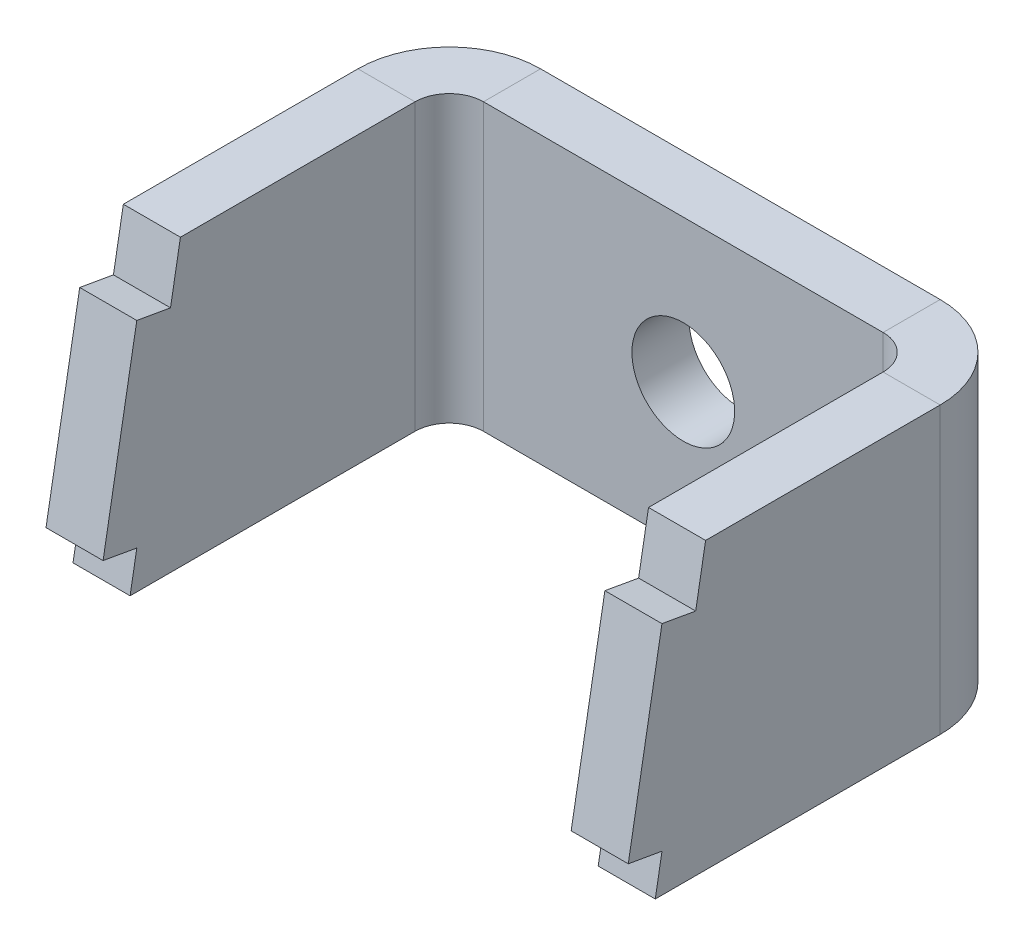
ISO-10303-21;
HEADER;
FILE_DESCRIPTION(('STEP AP214'),'2;1');
FILE_NAME('part.step','',(''),(''),'','','');
FILE_SCHEMA(('AUTOMOTIVE_DESIGN { 1 0 10303 214 1 1 1 1 }'));
ENDSEC;
DATA;
#1=APPLICATION_CONTEXT('core data for automotive mechanical design processes');
#2=APPLICATION_PROTOCOL_DEFINITION('international standard','automotive_design',2000,#1);
#3=PRODUCT_CONTEXT('',#1,'mechanical');
#4=PRODUCT('Part','Part','',(#3));
#5=PRODUCT_RELATED_PRODUCT_CATEGORY('part','',(#4));
#6=PRODUCT_DEFINITION_FORMATION('','',#4);
#7=PRODUCT_DEFINITION_CONTEXT('part definition',#1,'design');
#8=PRODUCT_DEFINITION('design','',#6,#7);
#9=PRODUCT_DEFINITION_SHAPE('','',#8);
#10=(LENGTH_UNIT() NAMED_UNIT(*) SI_UNIT(.MILLI.,.METRE.));
#11=(NAMED_UNIT(*) PLANE_ANGLE_UNIT() SI_UNIT($,.RADIAN.));
#12=(NAMED_UNIT(*) SI_UNIT($,.STERADIAN.) SOLID_ANGLE_UNIT());
#13=UNCERTAINTY_MEASURE_WITH_UNIT(LENGTH_MEASURE(1.E-05),#10,'distance_accuracy_value','');
#14=(GEOMETRIC_REPRESENTATION_CONTEXT(3) GLOBAL_UNCERTAINTY_ASSIGNED_CONTEXT((#13)) GLOBAL_UNIT_ASSIGNED_CONTEXT((#10,
#11,#12)) REPRESENTATION_CONTEXT('',''));
#15=CARTESIAN_POINT('',(0.,0.,0.));
#16=DIRECTION('',(0.,0.,1.));
#17=DIRECTION('',(1.,0.,0.));
#18=AXIS2_PLACEMENT_3D('',#15,#16,#17);
#19=CARTESIAN_POINT('',(17.5,25.,-5.));
#20=DIRECTION('',(0.,1.,0.));
#21=DIRECTION('',(-1.,0.,0.));
#22=AXIS2_PLACEMENT_3D('',#19,#20,#21);
#23=PLANE('',#22);
#24=DIRECTION('',(-1.,0.,0.));
#25=VECTOR('',#24,1.);
#26=CARTESIAN_POINT('',(17.5,25.,0.));
#27=LINE('',#26,#25);
#28=CARTESIAN_POINT('',(17.5,25.,0.));
#29=VERTEX_POINT('',#28);
#30=CARTESIAN_POINT('',(-17.5,25.,0.));
#31=VERTEX_POINT('',#30);
#32=EDGE_CURVE('E362',#29,#31,#27,.T.);
#33=ORIENTED_EDGE('',*,*,#32,.F.);
#34=DIRECTION('',(0.,0.,1.));
#35=VECTOR('',#34,1.);
#36=CARTESIAN_POINT('',(17.5,25.,-5.));
#37=LINE('',#36,#35);
#38=CARTESIAN_POINT('',(17.5,25.,-5.));
#39=VERTEX_POINT('',#38);
#40=EDGE_CURVE('E394',#39,#29,#37,.T.);
#41=ORIENTED_EDGE('',*,*,#40,.F.);
#42=DIRECTION('',(-1.,0.,0.));
#43=VECTOR('',#42,1.);
#44=CARTESIAN_POINT('',(17.5,25.,-5.));
#45=LINE('',#44,#43);
#46=CARTESIAN_POINT('',(-17.5,25.,-5.));
#47=VERTEX_POINT('',#46);
#48=EDGE_CURVE('E371',#39,#47,#45,.T.);
#49=ORIENTED_EDGE('',*,*,#48,.T.);
#50=DIRECTION('',(0.,0.,1.));
#51=VECTOR('',#50,1.);
#52=CARTESIAN_POINT('',(-17.5,25.,-5.));
#53=LINE('',#52,#51);
#54=EDGE_CURVE('E383',#47,#31,#53,.T.);
#55=ORIENTED_EDGE('',*,*,#54,.T.);
#56=EDGE_LOOP('',(#33,#41,#49,#55));
#57=FACE_BOUND('',#56,.T.);
#58=ADVANCED_FACE('F83',(#57),#23,.T.);
#59=CARTESIAN_POINT('',(-17.5,0.,-5.));
#60=DIRECTION('',(0.,-1.,0.));
#61=DIRECTION('',(1.,0.,0.));
#62=AXIS2_PLACEMENT_3D('',#59,#60,#61);
#63=PLANE('',#62);
#64=DIRECTION('',(1.,0.,0.));
#65=VECTOR('',#64,1.);
#66=CARTESIAN_POINT('',(-17.5,0.,0.));
#67=LINE('',#66,#65);
#68=CARTESIAN_POINT('',(-17.5,0.,0.));
#69=VERTEX_POINT('',#68);
#70=CARTESIAN_POINT('',(17.5,0.,0.));
#71=VERTEX_POINT('',#70);
#72=EDGE_CURVE('E389',#69,#71,#67,.T.);
#73=ORIENTED_EDGE('',*,*,#72,.F.);
#74=DIRECTION('',(0.,0.,1.));
#75=VECTOR('',#74,1.);
#76=CARTESIAN_POINT('',(-17.5,0.,-5.));
#77=LINE('',#76,#75);
#78=CARTESIAN_POINT('',(-17.5,0.,-5.));
#79=VERTEX_POINT('',#78);
#80=EDGE_CURVE('E399',#79,#69,#77,.T.);
#81=ORIENTED_EDGE('',*,*,#80,.F.);
#82=DIRECTION('',(1.,0.,0.));
#83=VECTOR('',#82,1.);
#84=CARTESIAN_POINT('',(-17.5,0.,-5.));
#85=LINE('',#84,#83);
#86=CARTESIAN_POINT('',(17.5,0.,-5.));
#87=VERTEX_POINT('',#86);
#88=EDGE_CURVE('E378',#79,#87,#85,.T.);
#89=ORIENTED_EDGE('',*,*,#88,.T.);
#90=DIRECTION('',(0.,0.,1.));
#91=VECTOR('',#90,1.);
#92=CARTESIAN_POINT('',(17.5,0.,-5.));
#93=LINE('',#92,#91);
#94=EDGE_CURVE('E397',#87,#71,#93,.T.);
#95=ORIENTED_EDGE('',*,*,#94,.T.);
#96=EDGE_LOOP('',(#73,#81,#89,#95));
#97=FACE_BOUND('',#96,.T.);
#98=ADVANCED_FACE('F438',(#97),#63,.T.);
#99=CARTESIAN_POINT('',(0.,0.,-5.));
#100=DIRECTION('',(0.,0.,-1.));
#101=DIRECTION('',(-1.,0.,0.));
#102=AXIS2_PLACEMENT_3D('',#99,#100,#101);
#103=PLANE('',#102);
#104=CARTESIAN_POINT('',(0.,12.5,-5.));
#105=DIRECTION('',(0.,0.,-1.));
#106=DIRECTION('',(-1.,0.,0.));
#107=AXIS2_PLACEMENT_3D('',#104,#105,#106);
#108=CIRCLE('',#107,4.5);
#109=CARTESIAN_POINT('',(-4.5,12.5,-5.));
#110=VERTEX_POINT('',#109);
#111=EDGE_CURVE('E253',#110,#110,#108,.T.);
#112=ORIENTED_EDGE('',*,*,#111,.F.);
#113=EDGE_LOOP('',(#112));
#114=FACE_BOUND('',#113,.T.);
#115=ORIENTED_EDGE('',*,*,#48,.F.);
#116=DIRECTION('',(0.,1.,0.));
#117=VECTOR('',#116,1.);
#118=CARTESIAN_POINT('',(17.5,0.,-5.));
#119=LINE('',#118,#117);
#120=EDGE_CURVE('E380',#87,#39,#119,.T.);
#121=ORIENTED_EDGE('',*,*,#120,.F.);
#122=ORIENTED_EDGE('',*,*,#88,.F.);
#123=DIRECTION('',(0.,-1.,0.));
#124=VECTOR('',#123,1.);
#125=CARTESIAN_POINT('',(-17.5,0.,-5.));
#126=LINE('',#125,#124);
#127=EDGE_CURVE('E374',#47,#79,#126,.T.);
#128=ORIENTED_EDGE('',*,*,#127,.F.);
#129=EDGE_LOOP('',(#115,#121,#122,#128));
#130=FACE_BOUND('',#129,.T.);
#131=ADVANCED_FACE('F434',(#114,#130),#103,.T.);
#132=CARTESIAN_POINT('',(0.,0.,0.));
#133=DIRECTION('',(0.,0.,-1.));
#134=DIRECTION('',(-1.,0.,0.));
#135=AXIS2_PLACEMENT_3D('',#132,#133,#134);
#136=PLANE('',#135);
#137=CARTESIAN_POINT('',(0.,12.5,0.));
#138=DIRECTION('',(0.,0.,-1.));
#139=DIRECTION('',(-1.,0.,0.));
#140=AXIS2_PLACEMENT_3D('',#137,#138,#139);
#141=CIRCLE('',#140,4.5);
#142=CARTESIAN_POINT('',(-4.5,12.5,0.));
#143=VERTEX_POINT('',#142);
#144=EDGE_CURVE('E86',#143,#143,#141,.T.);
#145=ORIENTED_EDGE('',*,*,#144,.T.);
#146=EDGE_LOOP('',(#145));
#147=FACE_BOUND('',#146,.T.);
#148=ORIENTED_EDGE('',*,*,#32,.T.);
#149=DIRECTION('',(0.,-1.,0.));
#150=VECTOR('',#149,1.);
#151=CARTESIAN_POINT('',(-17.5,0.,0.));
#152=LINE('',#151,#150);
#153=EDGE_CURVE('E386',#31,#69,#152,.T.);
#154=ORIENTED_EDGE('',*,*,#153,.T.);
#155=ORIENTED_EDGE('',*,*,#72,.T.);
#156=DIRECTION('',(0.,1.,0.));
#157=VECTOR('',#156,1.);
#158=CARTESIAN_POINT('',(17.5,0.,0.));
#159=LINE('',#158,#157);
#160=EDGE_CURVE('E375',#71,#29,#159,.T.);
#161=ORIENTED_EDGE('',*,*,#160,.T.);
#162=EDGE_LOOP('',(#148,#154,#155,#161));
#163=FACE_BOUND('',#162,.T.);
#164=ADVANCED_FACE('F437',(#147,#163),#136,.F.);
#165=CARTESIAN_POINT('',(-17.5,25.,3.));
#166=DIRECTION('',(0.,1.,0.));
#167=DIRECTION('',(0.,0.,1.));
#168=AXIS2_PLACEMENT_3D('',#165,#166,#167);
#169=PLANE('',#168);
#170=DIRECTION('',(-1.,0.,0.));
#171=VECTOR('',#170,1.);
#172=CARTESIAN_POINT('',(-25.5,25.,2.99999999999997));
#173=LINE('',#172,#171);
#174=CARTESIAN_POINT('',(-20.5,25.,2.99999999999999));
#175=VERTEX_POINT('',#174);
#176=CARTESIAN_POINT('',(-25.5,25.,2.99999999999997));
#177=VERTEX_POINT('',#176);
#178=EDGE_CURVE('E329',#175,#177,#173,.T.);
#179=ORIENTED_EDGE('',*,*,#178,.F.);
#180=CARTESIAN_POINT('',(-17.5,25.,3.));
#181=DIRECTION('',(0.,-1.,0.));
#182=DIRECTION('',(0.,0.,-1.));
#183=AXIS2_PLACEMENT_3D('',#180,#181,#182);
#184=CIRCLE('',#183,3.);
#185=EDGE_CURVE('E366',#31,#175,#184,.F.);
#186=ORIENTED_EDGE('',*,*,#185,.F.);
#187=ORIENTED_EDGE('',*,*,#54,.F.);
#188=CARTESIAN_POINT('',(-17.5,25.,3.));
#189=DIRECTION('',(0.,-1.,0.));
#190=DIRECTION('',(0.,0.,-1.));
#191=AXIS2_PLACEMENT_3D('',#188,#189,#190);
#192=CIRCLE('',#191,8.);
#193=EDGE_CURVE('E359',#47,#177,#192,.F.);
#194=ORIENTED_EDGE('',*,*,#193,.T.);
#195=EDGE_LOOP('',(#179,#186,#187,#194));
#196=FACE_BOUND('',#195,.T.);
#197=ADVANCED_FACE('F483',(#196),#169,.T.);
#198=CARTESIAN_POINT('',(-17.5,0.,3.));
#199=DIRECTION('',(0.,1.,0.));
#200=DIRECTION('',(0.,0.,1.));
#201=AXIS2_PLACEMENT_3D('',#198,#199,#200);
#202=PLANE('',#201);
#203=CARTESIAN_POINT('',(-17.5,0.,3.));
#204=DIRECTION('',(0.,-1.,0.));
#205=DIRECTION('',(0.,0.,-1.));
#206=AXIS2_PLACEMENT_3D('',#203,#204,#205);
#207=CIRCLE('',#206,3.);
#208=CARTESIAN_POINT('',(-20.5,0.,2.99999999999999));
#209=VERTEX_POINT('',#208);
#210=EDGE_CURVE('E340',#209,#69,#207,.T.);
#211=ORIENTED_EDGE('',*,*,#210,.F.);
#212=DIRECTION('',(-1.,0.,0.));
#213=VECTOR('',#212,1.);
#214=CARTESIAN_POINT('',(-20.5,0.,2.99999999999999));
#215=LINE('',#214,#213);
#216=CARTESIAN_POINT('',(-25.5,0.,2.99999999999997));
#217=VERTEX_POINT('',#216);
#218=EDGE_CURVE('E351',#209,#217,#215,.T.);
#219=ORIENTED_EDGE('',*,*,#218,.T.);
#220=CARTESIAN_POINT('',(-17.5,0.,3.));
#221=DIRECTION('',(0.,-1.,0.));
#222=DIRECTION('',(0.,0.,-1.));
#223=AXIS2_PLACEMENT_3D('',#220,#221,#222);
#224=CIRCLE('',#223,8.);
#225=EDGE_CURVE('E363',#217,#79,#224,.T.);
#226=ORIENTED_EDGE('',*,*,#225,.T.);
#227=ORIENTED_EDGE('',*,*,#80,.T.);
#228=EDGE_LOOP('',(#211,#219,#226,#227));
#229=FACE_BOUND('',#228,.T.);
#230=ADVANCED_FACE('F485',(#229),#202,.F.);
#231=CARTESIAN_POINT('',(-17.5,0.,3.));
#232=DIRECTION('',(0.,-1.,0.));
#233=DIRECTION('',(-1.,0.,0.));
#234=AXIS2_PLACEMENT_3D('',#231,#232,#233);
#235=CYLINDRICAL_SURFACE('',#234,8.);
#236=ORIENTED_EDGE('',*,*,#127,.T.);
#237=ORIENTED_EDGE('',*,*,#225,.F.);
#238=DIRECTION('',(0.,-1.,0.));
#239=VECTOR('',#238,1.);
#240=CARTESIAN_POINT('',(-25.5,0.,2.99999999999997));
#241=LINE('',#240,#239);
#242=EDGE_CURVE('E348',#177,#217,#241,.T.);
#243=ORIENTED_EDGE('',*,*,#242,.F.);
#244=ORIENTED_EDGE('',*,*,#193,.F.);
#245=EDGE_LOOP('',(#236,#237,#243,#244));
#246=FACE_BOUND('',#245,.T.);
#247=ADVANCED_FACE('F488',(#246),#235,.T.);
#248=CARTESIAN_POINT('',(-17.5,0.,3.));
#249=DIRECTION('',(0.,-1.,0.));
#250=DIRECTION('',(-1.,0.,0.));
#251=AXIS2_PLACEMENT_3D('',#248,#249,#250);
#252=CYLINDRICAL_SURFACE('',#251,3.);
#253=ORIENTED_EDGE('',*,*,#153,.F.);
#254=ORIENTED_EDGE('',*,*,#185,.T.);
#255=DIRECTION('',(0.,1.,0.));
#256=VECTOR('',#255,1.);
#257=CARTESIAN_POINT('',(-20.5,25.,2.99999999999999));
#258=LINE('',#257,#256);
#259=EDGE_CURVE('E354',#175,#209,#258,.F.);
#260=ORIENTED_EDGE('',*,*,#259,.T.);
#261=ORIENTED_EDGE('',*,*,#210,.T.);
#262=EDGE_LOOP('',(#253,#254,#260,#261));
#263=FACE_BOUND('',#262,.T.);
#264=ADVANCED_FACE('F493',(#263),#252,.F.);
#265=CARTESIAN_POINT('',(-25.5,0.,0.));
#266=DIRECTION('',(0.,-1.,0.));
#267=DIRECTION('',(0.,0.,-1.));
#268=AXIS2_PLACEMENT_3D('',#265,#266,#267);
#269=PLANE('',#268);
#270=DIRECTION('',(1.,0.,0.));
#271=VECTOR('',#270,1.);
#272=CARTESIAN_POINT('',(-25.5000000000001,0.,27.9537201643429));
#273=LINE('',#272,#271);
#274=CARTESIAN_POINT('',(-25.5000000000001,0.,27.9537201643429));
#275=VERTEX_POINT('',#274);
#276=CARTESIAN_POINT('',(-20.5000000000001,0.,27.9537201643429));
#277=VERTEX_POINT('',#276);
#278=EDGE_CURVE('E262',#275,#277,#273,.T.);
#279=ORIENTED_EDGE('',*,*,#278,.F.);
#280=DIRECTION('',(0.,0.,-1.));
#281=VECTOR('',#280,1.);
#282=CARTESIAN_POINT('',(-25.5,0.,0.));
#283=LINE('',#282,#281);
#284=EDGE_CURVE('E338',#275,#217,#283,.T.);
#285=ORIENTED_EDGE('',*,*,#284,.T.);
#286=ORIENTED_EDGE('',*,*,#218,.F.);
#287=DIRECTION('',(0.,0.,1.));
#288=VECTOR('',#287,1.);
#289=CARTESIAN_POINT('',(-20.5,0.,0.));
#290=LINE('',#289,#288);
#291=EDGE_CURVE('E343',#277,#209,#290,.F.);
#292=ORIENTED_EDGE('',*,*,#291,.F.);
#293=EDGE_LOOP('',(#279,#285,#286,#292));
#294=FACE_BOUND('',#293,.T.);
#295=ADVANCED_FACE('F495',(#294),#269,.T.);
#296=CARTESIAN_POINT('',(-25.5000000000001,25.,31.));
#297=DIRECTION('',(0.,1.,0.));
#298=DIRECTION('',(0.,0.,1.));
#299=AXIS2_PLACEMENT_3D('',#296,#297,#298);
#300=PLANE('',#299);
#301=DIRECTION('',(1.,0.,0.));
#302=VECTOR('',#301,1.);
#303=CARTESIAN_POINT('',(-25.5000000000002,25.,23.5455456466315));
#304=LINE('',#303,#302);
#305=CARTESIAN_POINT('',(-25.5000000000002,25.,23.5455456466315));
#306=VERTEX_POINT('',#305);
#307=CARTESIAN_POINT('',(-20.5000000000001,25.,23.5455456466315));
#308=VERTEX_POINT('',#307);
#309=EDGE_CURVE('E237',#306,#308,#304,.T.);
#310=ORIENTED_EDGE('',*,*,#309,.T.);
#311=DIRECTION('',(0.,0.,-1.));
#312=VECTOR('',#311,1.);
#313=CARTESIAN_POINT('',(-20.5,25.,0.));
#314=LINE('',#313,#312);
#315=EDGE_CURVE('E345',#175,#308,#314,.F.);
#316=ORIENTED_EDGE('',*,*,#315,.F.);
#317=ORIENTED_EDGE('',*,*,#178,.T.);
#318=DIRECTION('',(0.,0.,1.));
#319=VECTOR('',#318,1.);
#320=CARTESIAN_POINT('',(-25.5000000000001,25.,31.));
#321=LINE('',#320,#319);
#322=EDGE_CURVE('E341',#177,#306,#321,.T.);
#323=ORIENTED_EDGE('',*,*,#322,.T.);
#324=EDGE_LOOP('',(#310,#316,#317,#323));
#325=FACE_BOUND('',#324,.T.);
#326=ADVANCED_FACE('F500',(#325),#300,.T.);
#327=CARTESIAN_POINT('',(-25.5,0.,0.));
#328=DIRECTION('',(-1.,0.,0.));
#329=DIRECTION('',(0.,0.,1.));
#330=AXIS2_PLACEMENT_3D('',#327,#328,#329);
#331=PLANE('',#330);
#332=DIRECTION('',(0.,0.984807753012209,-0.173648177666924));
#333=VECTOR('',#332,1.);
#334=CARTESIAN_POINT('',(-25.5000000000001,20.0759612349389,24.4137865349661));
#335=LINE('',#334,#333);
#336=CARTESIAN_POINT('',(-25.5000000000001,20.0759612349389,24.4137865349661));
#337=VERTEX_POINT('',#336);
#338=EDGE_CURVE('E234',#337,#306,#335,.T.);
#339=ORIENTED_EDGE('',*,*,#338,.T.);
#340=ORIENTED_EDGE('',*,*,#322,.F.);
#341=ORIENTED_EDGE('',*,*,#242,.T.);
#342=ORIENTED_EDGE('',*,*,#284,.F.);
#343=DIRECTION('',(0.,0.984807753012209,-0.173648177666924));
#344=VECTOR('',#343,1.);
#345=CARTESIAN_POINT('',(-25.5000000000001,0.,27.9537201643429));
#346=LINE('',#345,#344);
#347=CARTESIAN_POINT('',(-25.5000000000001,3.33422943373138,27.3658055553038));
#348=VERTEX_POINT('',#347);
#349=EDGE_CURVE('E275',#275,#348,#346,.T.);
#350=ORIENTED_EDGE('',*,*,#349,.T.);
#351=DIRECTION('',(0.,0.173648177666923,0.984807753012209));
#352=VECTOR('',#351,1.);
#353=CARTESIAN_POINT('',(-25.5000000000001,3.33422943373138,27.3658055553038));
#354=LINE('',#353,#352);
#355=CARTESIAN_POINT('',(-25.5000000000001,3.85517396673215,30.3202288143404));
#356=VERTEX_POINT('',#355);
#357=EDGE_CURVE('E264',#348,#356,#354,.T.);
#358=ORIENTED_EDGE('',*,*,#357,.T.);
#359=DIRECTION('',(0.,0.984807753012209,-0.173648177666923));
#360=VECTOR('',#359,1.);
#361=CARTESIAN_POINT('',(-25.5000000000001,25.,26.5918254822887));
#362=LINE('',#361,#360);
#363=CARTESIAN_POINT('',(-25.5000000000001,20.5969057679397,27.3682097940027));
#364=VERTEX_POINT('',#363);
#365=EDGE_CURVE('E247',#356,#364,#362,.T.);
#366=ORIENTED_EDGE('',*,*,#365,.T.);
#367=DIRECTION('',(0.,-0.173648177666923,-0.984807753012209));
#368=VECTOR('',#367,1.);
#369=CARTESIAN_POINT('',(-25.5000000000001,20.5969057679397,27.3682097940027));
#370=LINE('',#369,#368);
#371=EDGE_CURVE('E224',#364,#337,#370,.T.);
#372=ORIENTED_EDGE('',*,*,#371,.T.);
#373=EDGE_LOOP('',(#339,#340,#341,#342,#350,#358,#366,#372));
#374=FACE_BOUND('',#373,.T.);
#375=ADVANCED_FACE('F244',(#374),#331,.T.);
#376=CARTESIAN_POINT('',(-20.5,0.,0.));
#377=DIRECTION('',(-1.,0.,0.));
#378=DIRECTION('',(0.,0.,1.));
#379=AXIS2_PLACEMENT_3D('',#376,#377,#378);
#380=PLANE('',#379);
#381=ORIENTED_EDGE('',*,*,#315,.T.);
#382=DIRECTION('',(0.,-0.984807753012209,0.173648177666924));
#383=VECTOR('',#382,1.);
#384=CARTESIAN_POINT('',(-20.5000000000001,4.78036768854694,27.1108123631452));
#385=LINE('',#384,#383);
#386=CARTESIAN_POINT('',(-20.5000000000001,20.0759612349389,24.4137865349661));
#387=VERTEX_POINT('',#386);
#388=EDGE_CURVE('E291',#308,#387,#385,.T.);
#389=ORIENTED_EDGE('',*,*,#388,.T.);
#390=DIRECTION('',(0.,0.173648177666923,0.98480775301221));
#391=VECTOR('',#390,1.);
#392=CARTESIAN_POINT('',(-20.5,15.295593546392,-2.69702582817913));
#393=LINE('',#392,#391);
#394=CARTESIAN_POINT('',(-20.5000000000001,20.5969057679397,27.3682097940027));
#395=VERTEX_POINT('',#394);
#396=EDGE_CURVE('E227',#387,#395,#393,.T.);
#397=ORIENTED_EDGE('',*,*,#396,.T.);
#398=DIRECTION('',(0.,-0.984807753012209,0.173648177666923));
#399=VECTOR('',#398,1.);
#400=CARTESIAN_POINT('',(-20.5000000000001,5.3013122215477,30.0652356221818));
#401=LINE('',#400,#399);
#402=CARTESIAN_POINT('',(-20.5000000000001,3.85517396673215,30.3202288143404));
#403=VERTEX_POINT('',#402);
#404=EDGE_CURVE('E300',#395,#403,#401,.T.);
#405=ORIENTED_EDGE('',*,*,#404,.T.);
#406=DIRECTION('',(0.,-0.173648177666923,-0.984807753012209));
#407=VECTOR('',#406,1.);
#408=CARTESIAN_POINT('',(-20.5,-1.44613825481555,0.254993192158563));
#409=LINE('',#408,#407);
#410=CARTESIAN_POINT('',(-20.5000000000001,3.33422943373138,27.3658055553038));
#411=VERTEX_POINT('',#410);
#412=EDGE_CURVE('E283',#403,#411,#409,.T.);
#413=ORIENTED_EDGE('',*,*,#412,.T.);
#414=DIRECTION('',(0.,-0.984807753012209,0.173648177666924));
#415=VECTOR('',#414,1.);
#416=CARTESIAN_POINT('',(-20.5000000000001,4.78036768854693,27.1108123631452));
#417=LINE('',#416,#415);
#418=EDGE_CURVE('E288',#411,#277,#417,.T.);
#419=ORIENTED_EDGE('',*,*,#418,.T.);
#420=ORIENTED_EDGE('',*,*,#291,.T.);
#421=ORIENTED_EDGE('',*,*,#259,.F.);
#422=EDGE_LOOP('',(#381,#389,#397,#405,#413,#419,#420,#421));
#423=FACE_BOUND('',#422,.T.);
#424=ADVANCED_FACE('F507',(#423),#380,.F.);
#425=CARTESIAN_POINT('',(17.5,0.,3.));
#426=DIRECTION('',(0.,-1.,0.));
#427=DIRECTION('',(0.,0.,-1.));
#428=AXIS2_PLACEMENT_3D('',#425,#426,#427);
#429=PLANE('',#428);
#430=DIRECTION('',(1.,0.,0.));
#431=VECTOR('',#430,1.);
#432=CARTESIAN_POINT('',(25.5,0.,2.99999999999997));
#433=LINE('',#432,#431);
#434=CARTESIAN_POINT('',(20.5,0.,2.99999999999999));
#435=VERTEX_POINT('',#434);
#436=CARTESIAN_POINT('',(25.5,0.,2.99999999999997));
#437=VERTEX_POINT('',#436);
#438=EDGE_CURVE('E303',#435,#437,#433,.T.);
#439=ORIENTED_EDGE('',*,*,#438,.F.);
#440=CARTESIAN_POINT('',(17.5,0.,3.));
#441=DIRECTION('',(0.,1.,0.));
#442=DIRECTION('',(0.,0.,1.));
#443=AXIS2_PLACEMENT_3D('',#440,#441,#442);
#444=CIRCLE('',#443,3.);
#445=EDGE_CURVE('E333',#71,#435,#444,.F.);
#446=ORIENTED_EDGE('',*,*,#445,.F.);
#447=ORIENTED_EDGE('',*,*,#94,.F.);
#448=CARTESIAN_POINT('',(17.5,0.,3.));
#449=DIRECTION('',(0.,1.,0.));
#450=DIRECTION('',(0.,0.,1.));
#451=AXIS2_PLACEMENT_3D('',#448,#449,#450);
#452=CIRCLE('',#451,8.);
#453=EDGE_CURVE('E326',#87,#437,#452,.F.);
#454=ORIENTED_EDGE('',*,*,#453,.T.);
#455=EDGE_LOOP('',(#439,#446,#447,#454));
#456=FACE_BOUND('',#455,.T.);
#457=ADVANCED_FACE('F510',(#456),#429,.T.);
#458=CARTESIAN_POINT('',(17.5,25.,3.));
#459=DIRECTION('',(0.,-1.,0.));
#460=DIRECTION('',(0.,0.,-1.));
#461=AXIS2_PLACEMENT_3D('',#458,#459,#460);
#462=PLANE('',#461);
#463=CARTESIAN_POINT('',(17.5,25.,3.));
#464=DIRECTION('',(0.,1.,0.));
#465=DIRECTION('',(0.,0.,1.));
#466=AXIS2_PLACEMENT_3D('',#463,#464,#465);
#467=CIRCLE('',#466,3.);
#468=CARTESIAN_POINT('',(20.5,25.,2.99999999999999));
#469=VERTEX_POINT('',#468);
#470=EDGE_CURVE('E306',#469,#29,#467,.T.);
#471=ORIENTED_EDGE('',*,*,#470,.F.);
#472=DIRECTION('',(1.,0.,0.));
#473=VECTOR('',#472,1.);
#474=CARTESIAN_POINT('',(20.5,25.,2.99999999999999));
#475=LINE('',#474,#473);
#476=CARTESIAN_POINT('',(25.5,25.,2.99999999999997));
#477=VERTEX_POINT('',#476);
#478=EDGE_CURVE('E318',#469,#477,#475,.T.);
#479=ORIENTED_EDGE('',*,*,#478,.T.);
#480=CARTESIAN_POINT('',(17.5,25.,3.));
#481=DIRECTION('',(0.,1.,0.));
#482=DIRECTION('',(0.,0.,1.));
#483=AXIS2_PLACEMENT_3D('',#480,#481,#482);
#484=CIRCLE('',#483,8.);
#485=EDGE_CURVE('E330',#477,#39,#484,.T.);
#486=ORIENTED_EDGE('',*,*,#485,.T.);
#487=ORIENTED_EDGE('',*,*,#40,.T.);
#488=EDGE_LOOP('',(#471,#479,#486,#487));
#489=FACE_BOUND('',#488,.T.);
#490=ADVANCED_FACE('F451',(#489),#462,.F.);
#491=CARTESIAN_POINT('',(17.5,25.,3.));
#492=DIRECTION('',(0.,1.,0.));
#493=DIRECTION('',(1.,0.,0.));
#494=AXIS2_PLACEMENT_3D('',#491,#492,#493);
#495=CYLINDRICAL_SURFACE('',#494,8.);
#496=ORIENTED_EDGE('',*,*,#120,.T.);
#497=ORIENTED_EDGE('',*,*,#485,.F.);
#498=DIRECTION('',(0.,1.,0.));
#499=VECTOR('',#498,1.);
#500=CARTESIAN_POINT('',(25.5,0.,2.99999999999997));
#501=LINE('',#500,#499);
#502=EDGE_CURVE('E315',#437,#477,#501,.T.);
#503=ORIENTED_EDGE('',*,*,#502,.F.);
#504=ORIENTED_EDGE('',*,*,#453,.F.);
#505=EDGE_LOOP('',(#496,#497,#503,#504));
#506=FACE_BOUND('',#505,.T.);
#507=ADVANCED_FACE('F450',(#506),#495,.T.);
#508=CARTESIAN_POINT('',(17.5,25.,3.));
#509=DIRECTION('',(0.,1.,0.));
#510=DIRECTION('',(1.,0.,0.));
#511=AXIS2_PLACEMENT_3D('',#508,#509,#510);
#512=CYLINDRICAL_SURFACE('',#511,3.);
#513=ORIENTED_EDGE('',*,*,#160,.F.);
#514=ORIENTED_EDGE('',*,*,#445,.T.);
#515=DIRECTION('',(0.,-1.,0.));
#516=VECTOR('',#515,1.);
#517=CARTESIAN_POINT('',(20.5,0.,2.99999999999999));
#518=LINE('',#517,#516);
#519=EDGE_CURVE('E321',#435,#469,#518,.F.);
#520=ORIENTED_EDGE('',*,*,#519,.T.);
#521=ORIENTED_EDGE('',*,*,#470,.T.);
#522=EDGE_LOOP('',(#513,#514,#520,#521));
#523=FACE_BOUND('',#522,.T.);
#524=ADVANCED_FACE('F518',(#523),#512,.F.);
#525=CARTESIAN_POINT('',(25.5,25.,0.));
#526=DIRECTION('',(0.,1.,0.));
#527=DIRECTION('',(-1.,0.,0.));
#528=AXIS2_PLACEMENT_3D('',#525,#526,#527);
#529=PLANE('',#528);
#530=CARTESIAN_POINT('',(20.5000000000001,25.,23.5455456466313));
#531=VERTEX_POINT('',#530);
#532=CARTESIAN_POINT('',(25.5000000000001,25.,23.5455456466313));
#533=VERTEX_POINT('',#532);
#534=EDGE_CURVE('E230',#531,#533,#304,.T.);
#535=ORIENTED_EDGE('',*,*,#534,.T.);
#536=DIRECTION('',(0.,0.,-1.));
#537=VECTOR('',#536,1.);
#538=CARTESIAN_POINT('',(25.5,25.,0.));
#539=LINE('',#538,#537);
#540=EDGE_CURVE('E304',#533,#477,#539,.T.);
#541=ORIENTED_EDGE('',*,*,#540,.T.);
#542=ORIENTED_EDGE('',*,*,#478,.F.);
#543=DIRECTION('',(0.,0.,1.));
#544=VECTOR('',#543,1.);
#545=CARTESIAN_POINT('',(20.5,25.,0.));
#546=LINE('',#545,#544);
#547=EDGE_CURVE('E310',#531,#469,#546,.F.);
#548=ORIENTED_EDGE('',*,*,#547,.F.);
#549=EDGE_LOOP('',(#535,#541,#542,#548));
#550=FACE_BOUND('',#549,.T.);
#551=ADVANCED_FACE('F456',(#550),#529,.T.);
#552=CARTESIAN_POINT('',(25.5000000000001,0.,31.));
#553=DIRECTION('',(0.,-1.,0.));
#554=DIRECTION('',(1.,0.,0.));
#555=AXIS2_PLACEMENT_3D('',#552,#553,#554);
#556=PLANE('',#555);
#557=CARTESIAN_POINT('',(20.5000000000001,0.,27.9537201643428));
#558=VERTEX_POINT('',#557);
#559=CARTESIAN_POINT('',(25.5000000000001,0.,27.9537201643428));
#560=VERTEX_POINT('',#559);
#561=EDGE_CURVE('E265',#558,#560,#273,.T.);
#562=ORIENTED_EDGE('',*,*,#561,.F.);
#563=DIRECTION('',(0.,0.,-1.));
#564=VECTOR('',#563,1.);
#565=CARTESIAN_POINT('',(20.5,0.,0.));
#566=LINE('',#565,#564);
#567=EDGE_CURVE('E312',#435,#558,#566,.F.);
#568=ORIENTED_EDGE('',*,*,#567,.F.);
#569=ORIENTED_EDGE('',*,*,#438,.T.);
#570=DIRECTION('',(0.,0.,1.));
#571=VECTOR('',#570,1.);
#572=CARTESIAN_POINT('',(25.5000000000001,0.,31.));
#573=LINE('',#572,#571);
#574=EDGE_CURVE('E307',#437,#560,#573,.T.);
#575=ORIENTED_EDGE('',*,*,#574,.T.);
#576=EDGE_LOOP('',(#562,#568,#569,#575));
#577=FACE_BOUND('',#576,.T.);
#578=ADVANCED_FACE('F415',(#577),#556,.T.);
#579=CARTESIAN_POINT('',(25.5,0.,0.));
#580=DIRECTION('',(1.,0.,0.));
#581=DIRECTION('',(0.,0.,-1.));
#582=AXIS2_PLACEMENT_3D('',#579,#580,#581);
#583=PLANE('',#582);
#584=DIRECTION('',(0.,0.984807753012209,-0.173648177666924));
#585=VECTOR('',#584,1.);
#586=CARTESIAN_POINT('',(25.5000000000001,20.075961234939,24.4137865349659));
#587=LINE('',#586,#585);
#588=CARTESIAN_POINT('',(25.5000000000001,20.075961234939,24.4137865349659));
#589=VERTEX_POINT('',#588);
#590=EDGE_CURVE('E248',#589,#533,#587,.T.);
#591=ORIENTED_EDGE('',*,*,#590,.F.);
#592=DIRECTION('',(0.,-0.173648177666923,-0.984807753012209));
#593=VECTOR('',#592,1.);
#594=CARTESIAN_POINT('',(25.5000000000001,20.5969057679397,27.3682097940026));
#595=LINE('',#594,#593);
#596=CARTESIAN_POINT('',(25.5000000000001,20.5969057679397,27.3682097940026));
#597=VERTEX_POINT('',#596);
#598=EDGE_CURVE('E250',#597,#589,#595,.T.);
#599=ORIENTED_EDGE('',*,*,#598,.F.);
#600=DIRECTION('',(0.,0.984807753012209,-0.173648177666923));
#601=VECTOR('',#600,1.);
#602=CARTESIAN_POINT('',(25.5000000000001,25.,26.5918254822886));
#603=LINE('',#602,#601);
#604=CARTESIAN_POINT('',(25.5000000000001,3.85517396673216,30.3202288143403));
#605=VERTEX_POINT('',#604);
#606=EDGE_CURVE('E293',#605,#597,#603,.T.);
#607=ORIENTED_EDGE('',*,*,#606,.F.);
#608=DIRECTION('',(0.,0.173648177666923,0.984807753012209));
#609=VECTOR('',#608,1.);
#610=CARTESIAN_POINT('',(25.5000000000001,3.33422943373139,27.3658055553036));
#611=LINE('',#610,#609);
#612=CARTESIAN_POINT('',(25.5000000000001,3.33422943373139,27.3658055553036));
#613=VERTEX_POINT('',#612);
#614=EDGE_CURVE('E106',#613,#605,#611,.T.);
#615=ORIENTED_EDGE('',*,*,#614,.F.);
#616=DIRECTION('',(0.,0.984807753012209,-0.173648177666924));
#617=VECTOR('',#616,1.);
#618=CARTESIAN_POINT('',(25.5000000000001,0.,27.9537201643428));
#619=LINE('',#618,#617);
#620=EDGE_CURVE('E256',#560,#613,#619,.T.);
#621=ORIENTED_EDGE('',*,*,#620,.F.);
#622=ORIENTED_EDGE('',*,*,#574,.F.);
#623=ORIENTED_EDGE('',*,*,#502,.T.);
#624=ORIENTED_EDGE('',*,*,#540,.F.);
#625=EDGE_LOOP('',(#591,#599,#607,#615,#621,#622,#623,#624));
#626=FACE_BOUND('',#625,.T.);
#627=ADVANCED_FACE('F419',(#626),#583,.T.);
#628=CARTESIAN_POINT('',(20.5,0.,0.));
#629=DIRECTION('',(1.,0.,0.));
#630=DIRECTION('',(0.,0.,-1.));
#631=AXIS2_PLACEMENT_3D('',#628,#629,#630);
#632=PLANE('',#631);
#633=DIRECTION('',(0.,-0.173648177666923,-0.98480775301221));
#634=VECTOR('',#633,1.);
#635=CARTESIAN_POINT('',(20.5,15.2955935463921,-2.69702582817913));
#636=LINE('',#635,#634);
#637=CARTESIAN_POINT('',(20.5000000000001,20.5969057679397,27.3682097940026));
#638=VERTEX_POINT('',#637);
#639=CARTESIAN_POINT('',(20.5000000000001,20.075961234939,24.413786534966));
#640=VERTEX_POINT('',#639);
#641=EDGE_CURVE('E98',#638,#640,#636,.T.);
#642=ORIENTED_EDGE('',*,*,#641,.T.);
#643=DIRECTION('',(0.,0.984807753012209,-0.173648177666924));
#644=VECTOR('',#643,1.);
#645=CARTESIAN_POINT('',(20.5000000000001,4.78036768854693,27.110812363145));
#646=LINE('',#645,#644);
#647=EDGE_CURVE('E13',#640,#531,#646,.T.);
#648=ORIENTED_EDGE('',*,*,#647,.T.);
#649=ORIENTED_EDGE('',*,*,#547,.T.);
#650=ORIENTED_EDGE('',*,*,#519,.F.);
#651=ORIENTED_EDGE('',*,*,#567,.T.);
#652=DIRECTION('',(0.,0.984807753012209,-0.173648177666924));
#653=VECTOR('',#652,1.);
#654=CARTESIAN_POINT('',(20.5000000000001,4.78036768854691,27.110812363145));
#655=LINE('',#654,#653);
#656=CARTESIAN_POINT('',(20.5000000000001,3.33422943373139,27.3658055553037));
#657=VERTEX_POINT('',#656);
#658=EDGE_CURVE('E91',#558,#657,#655,.T.);
#659=ORIENTED_EDGE('',*,*,#658,.T.);
#660=DIRECTION('',(0.,0.173648177666923,0.984807753012209));
#661=VECTOR('',#660,1.);
#662=CARTESIAN_POINT('',(20.5,-1.44613825481551,0.254993192158557));
#663=LINE('',#662,#661);
#664=CARTESIAN_POINT('',(20.5000000000001,3.85517396673216,30.3202288143403));
#665=VERTEX_POINT('',#664);
#666=EDGE_CURVE('E258',#657,#665,#663,.T.);
#667=ORIENTED_EDGE('',*,*,#666,.T.);
#668=DIRECTION('',(0.,0.984807753012209,-0.173648177666923));
#669=VECTOR('',#668,1.);
#670=CARTESIAN_POINT('',(20.5000000000001,5.30131222154768,30.0652356221817));
#671=LINE('',#670,#669);
#672=EDGE_CURVE('E295',#665,#638,#671,.T.);
#673=ORIENTED_EDGE('',*,*,#672,.T.);
#674=EDGE_LOOP('',(#642,#648,#649,#650,#651,#659,#667,#673));
#675=FACE_BOUND('',#674,.T.);
#676=ADVANCED_FACE('F405',(#675),#632,.F.);
#677=CARTESIAN_POINT('',(-25.5000000000001,25.,26.5918254822887));
#678=DIRECTION('',(0.,-0.173648177666923,-0.984807753012209));
#679=DIRECTION('',(0.,0.984807753012209,-0.173648177666923));
#680=AXIS2_PLACEMENT_3D('',#677,#678,#679);
#681=PLANE('',#680);
#682=ORIENTED_EDGE('',*,*,#606,.T.);
#683=DIRECTION('',(1.,0.,0.));
#684=VECTOR('',#683,1.);
#685=CARTESIAN_POINT('',(-25.5000000000001,20.5969057679397,27.3682097940027));
#686=LINE('',#685,#684);
#687=EDGE_CURVE('E241',#638,#597,#686,.T.);
#688=ORIENTED_EDGE('',*,*,#687,.F.);
#689=ORIENTED_EDGE('',*,*,#672,.F.);
#690=DIRECTION('',(1.,0.,0.));
#691=VECTOR('',#690,1.);
#692=CARTESIAN_POINT('',(-25.5000000000001,3.85517396673215,30.3202288143404));
#693=LINE('',#692,#691);
#694=EDGE_CURVE('E273',#665,#605,#693,.T.);
#695=ORIENTED_EDGE('',*,*,#694,.T.);
#696=EDGE_LOOP('',(#682,#688,#689,#695));
#697=FACE_BOUND('',#696,.T.);
#698=ADVANCED_FACE('F424',(#697),#681,.F.);
#699=ORIENTED_EDGE('',*,*,#404,.F.);
#700=EDGE_CURVE('E260',#364,#395,#686,.T.);
#701=ORIENTED_EDGE('',*,*,#700,.F.);
#702=ORIENTED_EDGE('',*,*,#365,.F.);
#703=EDGE_CURVE('E270',#356,#403,#693,.T.);
#704=ORIENTED_EDGE('',*,*,#703,.T.);
#705=EDGE_LOOP('',(#699,#701,#702,#704));
#706=FACE_BOUND('',#705,.T.);
#707=ADVANCED_FACE('F532',(#706),#681,.F.);
#708=CARTESIAN_POINT('',(-25.5000000000001,3.33422943373138,27.3658055553038));
#709=DIRECTION('',(0.,0.984807753012209,-0.173648177666923));
#710=DIRECTION('',(0.,0.173648177666923,0.984807753012209));
#711=AXIS2_PLACEMENT_3D('',#708,#709,#710);
#712=PLANE('',#711);
#713=ORIENTED_EDGE('',*,*,#703,.F.);
#714=ORIENTED_EDGE('',*,*,#357,.F.);
#715=DIRECTION('',(1.,0.,0.));
#716=VECTOR('',#715,1.);
#717=CARTESIAN_POINT('',(-25.5000000000001,3.33422943373138,27.3658055553038));
#718=LINE('',#717,#716);
#719=EDGE_CURVE('E266',#348,#411,#718,.T.);
#720=ORIENTED_EDGE('',*,*,#719,.T.);
#721=ORIENTED_EDGE('',*,*,#412,.F.);
#722=EDGE_LOOP('',(#713,#714,#720,#721));
#723=FACE_BOUND('',#722,.T.);
#724=ADVANCED_FACE('F535',(#723),#712,.F.);
#725=CARTESIAN_POINT('',(-25.5000000000001,0.,27.9537201643429));
#726=DIRECTION('',(0.,-0.173648177666924,-0.984807753012209));
#727=DIRECTION('',(0.,0.984807753012209,-0.173648177666924));
#728=AXIS2_PLACEMENT_3D('',#725,#726,#727);
#729=PLANE('',#728);
#730=ORIENTED_EDGE('',*,*,#719,.F.);
#731=ORIENTED_EDGE('',*,*,#349,.F.);
#732=ORIENTED_EDGE('',*,*,#278,.T.);
#733=ORIENTED_EDGE('',*,*,#418,.F.);
#734=EDGE_LOOP('',(#730,#731,#732,#733));
#735=FACE_BOUND('',#734,.T.);
#736=ADVANCED_FACE('F471',(#735),#729,.F.);
#737=CARTESIAN_POINT('',(-25.5000000000001,20.5969057679397,27.3682097940027));
#738=DIRECTION('',(0.,-0.984807753012209,0.173648177666923));
#739=DIRECTION('',(0.,-0.173648177666923,-0.98480775301221));
#740=AXIS2_PLACEMENT_3D('',#737,#738,#739);
#741=PLANE('',#740);
#742=DIRECTION('',(1.,0.,0.));
#743=VECTOR('',#742,1.);
#744=CARTESIAN_POINT('',(-25.5000000000001,20.0759612349389,24.4137865349661));
#745=LINE('',#744,#743);
#746=EDGE_CURVE('E220',#337,#387,#745,.T.);
#747=ORIENTED_EDGE('',*,*,#746,.F.);
#748=ORIENTED_EDGE('',*,*,#371,.F.);
#749=ORIENTED_EDGE('',*,*,#700,.T.);
#750=ORIENTED_EDGE('',*,*,#396,.F.);
#751=EDGE_LOOP('',(#747,#748,#749,#750));
#752=FACE_BOUND('',#751,.T.);
#753=ADVANCED_FACE('F222',(#752),#741,.F.);
#754=CARTESIAN_POINT('',(-25.5000000000001,20.0759612349389,24.4137865349661));
#755=DIRECTION('',(0.,-0.173648177666924,-0.984807753012209));
#756=DIRECTION('',(0.,0.984807753012209,-0.173648177666924));
#757=AXIS2_PLACEMENT_3D('',#754,#755,#756);
#758=PLANE('',#757);
#759=ORIENTED_EDGE('',*,*,#309,.F.);
#760=ORIENTED_EDGE('',*,*,#338,.F.);
#761=ORIENTED_EDGE('',*,*,#746,.T.);
#762=ORIENTED_EDGE('',*,*,#388,.F.);
#763=EDGE_LOOP('',(#759,#760,#761,#762));
#764=FACE_BOUND('',#763,.T.);
#765=ADVANCED_FACE('F235',(#764),#758,.F.);
#766=ORIENTED_EDGE('',*,*,#561,.T.);
#767=ORIENTED_EDGE('',*,*,#620,.T.);
#768=EDGE_CURVE('E269',#657,#613,#718,.T.);
#769=ORIENTED_EDGE('',*,*,#768,.F.);
#770=ORIENTED_EDGE('',*,*,#658,.F.);
#771=EDGE_LOOP('',(#766,#767,#769,#770));
#772=FACE_BOUND('',#771,.T.);
#773=ADVANCED_FACE('F412',(#772),#729,.F.);
#774=ORIENTED_EDGE('',*,*,#768,.T.);
#775=ORIENTED_EDGE('',*,*,#614,.T.);
#776=ORIENTED_EDGE('',*,*,#694,.F.);
#777=ORIENTED_EDGE('',*,*,#666,.F.);
#778=EDGE_LOOP('',(#774,#775,#776,#777));
#779=FACE_BOUND('',#778,.T.);
#780=ADVANCED_FACE('F467',(#779),#712,.F.);
#781=EDGE_CURVE('E231',#640,#589,#745,.T.);
#782=ORIENTED_EDGE('',*,*,#781,.T.);
#783=ORIENTED_EDGE('',*,*,#590,.T.);
#784=ORIENTED_EDGE('',*,*,#534,.F.);
#785=ORIENTED_EDGE('',*,*,#647,.F.);
#786=EDGE_LOOP('',(#782,#783,#784,#785));
#787=FACE_BOUND('',#786,.T.);
#788=ADVANCED_FACE('F458',(#787),#758,.F.);
#789=ORIENTED_EDGE('',*,*,#687,.T.);
#790=ORIENTED_EDGE('',*,*,#598,.T.);
#791=ORIENTED_EDGE('',*,*,#781,.F.);
#792=ORIENTED_EDGE('',*,*,#641,.F.);
#793=EDGE_LOOP('',(#789,#790,#791,#792));
#794=FACE_BOUND('',#793,.T.);
#795=ADVANCED_FACE('F459',(#794),#741,.F.);
#796=CARTESIAN_POINT('',(0.,12.5,30.3202288143404));
#797=DIRECTION('',(0.,0.,-1.));
#798=DIRECTION('',(-1.,0.,0.));
#799=AXIS2_PLACEMENT_3D('',#796,#797,#798);
#800=CYLINDRICAL_SURFACE('',#799,4.5);
#801=ORIENTED_EDGE('',*,*,#111,.T.);
#802=EDGE_LOOP('',(#801));
#803=FACE_BOUND('',#802,.T.);
#804=ORIENTED_EDGE('',*,*,#144,.F.);
#805=EDGE_LOOP('',(#804));
#806=FACE_BOUND('',#805,.T.);
#807=ADVANCED_FACE('F431',(#803,#806),#800,.F.);
#808=CLOSED_SHELL('',(#58,#98,#131,#164,#197,#230,#247,#264,#295,#326,#375,#424,#457,#490,#507,
#524,#551,#578,#627,#676,#698,#707,#724,#736,#753,#765,#773,#780,#788,#795,#807));
#809=MANIFOLD_SOLID_BREP('B2',#808);
#810=ADVANCED_BREP_SHAPE_REPRESENTATION('',(#18,#809),#14);
#811=SHAPE_DEFINITION_REPRESENTATION(#9,#810);
ENDSEC;
END-ISO-10303-21;
